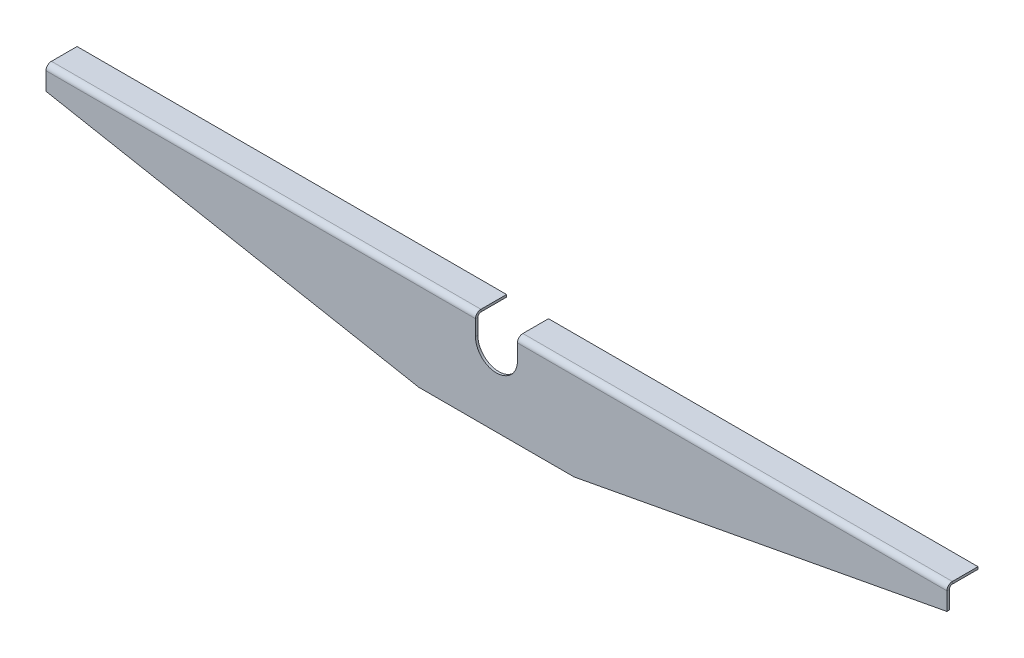
ISO-10303-21;
HEADER;
FILE_DESCRIPTION(('STEP AP214'),'2;1');
FILE_NAME('part.step','',(''),(''),'','','');
FILE_SCHEMA(('AUTOMOTIVE_DESIGN { 1 0 10303 214 1 1 1 1 }'));
ENDSEC;
DATA;
#1=APPLICATION_CONTEXT('core data for automotive mechanical design processes');
#2=APPLICATION_PROTOCOL_DEFINITION('international standard','automotive_design',2000,#1);
#3=PRODUCT_CONTEXT('',#1,'mechanical');
#4=PRODUCT('Part','Part','',(#3));
#5=PRODUCT_RELATED_PRODUCT_CATEGORY('part','',(#4));
#6=PRODUCT_DEFINITION_FORMATION('','',#4);
#7=PRODUCT_DEFINITION_CONTEXT('part definition',#1,'design');
#8=PRODUCT_DEFINITION('design','',#6,#7);
#9=PRODUCT_DEFINITION_SHAPE('','',#8);
#10=(LENGTH_UNIT() NAMED_UNIT(*) SI_UNIT(.MILLI.,.METRE.));
#11=(NAMED_UNIT(*) PLANE_ANGLE_UNIT() SI_UNIT($,.RADIAN.));
#12=(NAMED_UNIT(*) SI_UNIT($,.STERADIAN.) SOLID_ANGLE_UNIT());
#13=UNCERTAINTY_MEASURE_WITH_UNIT(LENGTH_MEASURE(1.E-05),#10,'distance_accuracy_value','');
#14=(GEOMETRIC_REPRESENTATION_CONTEXT(3) GLOBAL_UNCERTAINTY_ASSIGNED_CONTEXT((#13)) GLOBAL_UNIT_ASSIGNED_CONTEXT((#10,
#11,#12)) REPRESENTATION_CONTEXT('',''));
#15=CARTESIAN_POINT('',(0.,0.,0.));
#16=DIRECTION('',(0.,0.,1.));
#17=DIRECTION('',(1.,0.,0.));
#18=AXIS2_PLACEMENT_3D('',#15,#16,#17);
#19=CARTESIAN_POINT('',(-13.5000000000002,-3.50000000000006,-20.));
#20=DIRECTION('',(1.00000000000001,0.,0.));
#21=DIRECTION('',(0.,0.,-1.));
#22=AXIS2_PLACEMENT_3D('',#19,#20,#21);
#23=PLANE('',#22);
#24=DIRECTION('',(0.,0.,1.));
#25=VECTOR('',#24,1.);
#26=CARTESIAN_POINT('',(-13.5000000000002,10.0000000000001,0.));
#27=LINE('',#26,#25);
#28=CARTESIAN_POINT('',(-13.5000000000002,10.0000000000002,-20.));
#29=VERTEX_POINT('',#28);
#30=CARTESIAN_POINT('',(-13.5000000000002,10.0000000000001,-3.49999999999995));
#31=VERTEX_POINT('',#30);
#32=EDGE_CURVE('E240',#29,#31,#27,.T.);
#33=ORIENTED_EDGE('',*,*,#32,.T.);
#34=DIRECTION('',(0.,-1.00000000000001,0.));
#35=VECTOR('',#34,1.);
#36=CARTESIAN_POINT('',(-13.5000000000002,10.0000000000001,-3.49999999999995));
#37=LINE('',#36,#35);
#38=CARTESIAN_POINT('',(-13.5000000000002,8.5000000000001,-3.49999999999995));
#39=VERTEX_POINT('',#38);
#40=EDGE_CURVE('E13',#31,#39,#37,.T.);
#41=ORIENTED_EDGE('',*,*,#40,.T.);
#42=DIRECTION('',(0.,0.,1.));
#43=VECTOR('',#42,1.);
#44=CARTESIAN_POINT('',(-13.5000000000002,8.50000000000009,0.));
#45=LINE('',#44,#43);
#46=CARTESIAN_POINT('',(-13.5000000000002,8.50000000000016,-20.));
#47=VERTEX_POINT('',#46);
#48=EDGE_CURVE('E85',#47,#39,#45,.T.);
#49=ORIENTED_EDGE('',*,*,#48,.F.);
#50=DIRECTION('',(0.,1.00000000000001,0.));
#51=VECTOR('',#50,1.);
#52=CARTESIAN_POINT('',(-13.5000000000002,10.0000000000002,-20.));
#53=LINE('',#52,#51);
#54=EDGE_CURVE('E390',#47,#29,#53,.T.);
#55=ORIENTED_EDGE('',*,*,#54,.T.);
#56=EDGE_LOOP('',(#33,#41,#49,#55));
#57=FACE_BOUND('',#56,.T.);
#58=ADVANCED_FACE('F70',(#57),#23,.T.);
#59=DIRECTION('',(0.,-1.00000000000001,0.));
#60=VECTOR('',#59,1.);
#61=CARTESIAN_POINT('',(-13.5000000000002,0.,-1.49999999999995));
#62=LINE('',#61,#60);
#63=CARTESIAN_POINT('',(-13.5000000000002,6.50000000000011,-1.49999999999995));
#64=VERTEX_POINT('',#63);
#65=CARTESIAN_POINT('',(-13.5000000000002,-3.50000000000006,-1.49999999999995));
#66=VERTEX_POINT('',#65);
#67=EDGE_CURVE('E237',#64,#66,#62,.T.);
#68=ORIENTED_EDGE('',*,*,#67,.F.);
#69=DIRECTION('',(0.,0.,1.));
#70=VECTOR('',#69,1.);
#71=CARTESIAN_POINT('',(-13.5000000000002,6.50000000000011,-1.49999999999995));
#72=LINE('',#71,#70);
#73=CARTESIAN_POINT('',(-13.5000000000002,6.50000000000011,0.));
#74=VERTEX_POINT('',#73);
#75=EDGE_CURVE('E79',#64,#74,#72,.T.);
#76=ORIENTED_EDGE('',*,*,#75,.T.);
#77=DIRECTION('',(0.,1.00000000000001,0.));
#78=VECTOR('',#77,1.);
#79=CARTESIAN_POINT('',(-13.5000000000002,-3.50000000000006,0.));
#80=LINE('',#79,#78);
#81=CARTESIAN_POINT('',(-13.5000000000002,-3.50000000000006,0.));
#82=VERTEX_POINT('',#81);
#83=EDGE_CURVE('E213',#82,#74,#80,.T.);
#84=ORIENTED_EDGE('',*,*,#83,.F.);
#85=DIRECTION('',(0.,0.,1.));
#86=VECTOR('',#85,1.);
#87=CARTESIAN_POINT('',(-13.5000000000002,-3.50000000000006,-20.));
#88=LINE('',#87,#86);
#89=EDGE_CURVE('E197',#66,#82,#88,.T.);
#90=ORIENTED_EDGE('',*,*,#89,.F.);
#91=EDGE_LOOP('',(#68,#76,#84,#90));
#92=FACE_BOUND('',#91,.T.);
#93=ADVANCED_FACE('F214',(#92),#23,.T.);
#94=CARTESIAN_POINT('',(13.5000000000002,-3.50000000000007,-20.));
#95=DIRECTION('',(1.00000000000001,0.,0.));
#96=DIRECTION('',(0.,0.,-1.));
#97=AXIS2_PLACEMENT_3D('',#94,#95,#96);
#98=PLANE('',#97);
#99=DIRECTION('',(0.,0.,1.));
#100=VECTOR('',#99,1.);
#101=CARTESIAN_POINT('',(13.5000000000002,8.50000000000006,0.));
#102=LINE('',#101,#100);
#103=CARTESIAN_POINT('',(13.5000000000002,8.50000000000013,-20.));
#104=VERTEX_POINT('',#103);
#105=CARTESIAN_POINT('',(13.5000000000002,8.50000000000007,-3.49999999999995));
#106=VERTEX_POINT('',#105);
#107=EDGE_CURVE('E248',#104,#106,#102,.T.);
#108=ORIENTED_EDGE('',*,*,#107,.T.);
#109=DIRECTION('',(0.,1.00000000000001,0.));
#110=VECTOR('',#109,1.);
#111=CARTESIAN_POINT('',(13.5000000000002,8.50000000000007,-3.49999999999995));
#112=LINE('',#111,#110);
#113=CARTESIAN_POINT('',(13.5000000000002,10.0000000000001,-3.49999999999995));
#114=VERTEX_POINT('',#113);
#115=EDGE_CURVE('E409',#106,#114,#112,.T.);
#116=ORIENTED_EDGE('',*,*,#115,.T.);
#117=DIRECTION('',(0.,0.,1.));
#118=VECTOR('',#117,1.);
#119=CARTESIAN_POINT('',(13.5000000000002,10.0000000000001,0.));
#120=LINE('',#119,#118);
#121=CARTESIAN_POINT('',(13.5000000000002,10.0000000000001,-20.));
#122=VERTEX_POINT('',#121);
#123=EDGE_CURVE('E259',#122,#114,#120,.T.);
#124=ORIENTED_EDGE('',*,*,#123,.F.);
#125=DIRECTION('',(0.,1.00000000000001,0.));
#126=VECTOR('',#125,1.);
#127=CARTESIAN_POINT('',(13.5000000000002,10.0000000000001,-20.));
#128=LINE('',#127,#126);
#129=EDGE_CURVE('E402',#104,#122,#128,.T.);
#130=ORIENTED_EDGE('',*,*,#129,.F.);
#131=EDGE_LOOP('',(#108,#116,#124,#130));
#132=FACE_BOUND('',#131,.T.);
#133=ADVANCED_FACE('F559',(#132),#98,.F.);
#134=DIRECTION('',(0.,1.00000000000001,0.));
#135=VECTOR('',#134,1.);
#136=CARTESIAN_POINT('',(13.5000000000002,-3.50000000000007,0.));
#137=LINE('',#136,#135);
#138=CARTESIAN_POINT('',(13.5000000000002,-3.50000000000007,0.));
#139=VERTEX_POINT('',#138);
#140=CARTESIAN_POINT('',(13.5000000000002,6.50000000000002,0.));
#141=VERTEX_POINT('',#140);
#142=EDGE_CURVE('E219',#139,#141,#137,.T.);
#143=ORIENTED_EDGE('',*,*,#142,.T.);
#144=DIRECTION('',(0.,0.,-1.));
#145=VECTOR('',#144,1.);
#146=CARTESIAN_POINT('',(13.5000000000002,6.50000000000002,0.));
#147=LINE('',#146,#145);
#148=CARTESIAN_POINT('',(13.5000000000002,6.50000000000002,-1.49999999999995));
#149=VERTEX_POINT('',#148);
#150=EDGE_CURVE('E406',#141,#149,#147,.T.);
#151=ORIENTED_EDGE('',*,*,#150,.T.);
#152=DIRECTION('',(0.,-1.00000000000001,0.));
#153=VECTOR('',#152,1.);
#154=CARTESIAN_POINT('',(13.5000000000002,0.,-1.50000000000006));
#155=LINE('',#154,#153);
#156=CARTESIAN_POINT('',(13.5000000000002,-3.50000000000007,-1.50000000000006));
#157=VERTEX_POINT('',#156);
#158=EDGE_CURVE('E256',#149,#157,#155,.T.);
#159=ORIENTED_EDGE('',*,*,#158,.T.);
#160=DIRECTION('',(0.,0.,1.));
#161=VECTOR('',#160,1.);
#162=CARTESIAN_POINT('',(13.5000000000002,-3.50000000000007,-20.));
#163=LINE('',#162,#161);
#164=EDGE_CURVE('E210',#157,#139,#163,.T.);
#165=ORIENTED_EDGE('',*,*,#164,.T.);
#166=EDGE_LOOP('',(#143,#151,#159,#165));
#167=FACE_BOUND('',#166,.T.);
#168=ADVANCED_FACE('F555',(#167),#98,.F.);
#169=CARTESIAN_POINT('',(290.000000000003,6.50000000000007,-3.49999999999995));
#170=DIRECTION('',(1.00000000000001,0.,0.));
#171=DIRECTION('',(0.,1.00000000000001,0.));
#172=AXIS2_PLACEMENT_3D('',#169,#170,#171);
#173=CYLINDRICAL_SURFACE('',#172,3.5);
#174=DIRECTION('',(1.00000000000001,0.,0.));
#175=VECTOR('',#174,1.);
#176=CARTESIAN_POINT('',(290.000000000003,6.50000000000007,0.));
#177=LINE('',#176,#175);
#178=CARTESIAN_POINT('',(-290.000000000003,6.50000000000005,0.));
#179=VERTEX_POINT('',#178);
#180=EDGE_CURVE('E324',#74,#179,#177,.F.);
#181=ORIENTED_EDGE('',*,*,#180,.F.);
#182=CARTESIAN_POINT('',(-13.5000000000002,6.50000000000011,-3.49999999999995));
#183=DIRECTION('',(1.00000000000001,0.,0.));
#184=DIRECTION('',(0.,0.,-1.));
#185=AXIS2_PLACEMENT_3D('',#182,#183,#184);
#186=CIRCLE('',#185,3.5);
#187=EDGE_CURVE('E244',#74,#31,#186,.F.);
#188=ORIENTED_EDGE('',*,*,#187,.T.);
#189=DIRECTION('',(1.00000000000001,0.,0.));
#190=VECTOR('',#189,1.);
#191=CARTESIAN_POINT('',(-290.000000000004,10.0000000000001,-3.49999999999995));
#192=LINE('',#191,#190);
#193=CARTESIAN_POINT('',(-290.000000000004,10.0000000000001,-3.49999999999995));
#194=VERTEX_POINT('',#193);
#195=EDGE_CURVE('E307',#31,#194,#192,.F.);
#196=ORIENTED_EDGE('',*,*,#195,.T.);
#197=CARTESIAN_POINT('',(-290.000000000003,6.50000000000005,-3.49999999999995));
#198=DIRECTION('',(1.00000000000001,0.,0.));
#199=DIRECTION('',(0.,0.,-1.));
#200=AXIS2_PLACEMENT_3D('',#197,#198,#199);
#201=CIRCLE('',#200,3.5);
#202=EDGE_CURVE('E323',#179,#194,#201,.F.);
#203=ORIENTED_EDGE('',*,*,#202,.F.);
#204=EDGE_LOOP('',(#181,#188,#196,#203));
#205=FACE_BOUND('',#204,.T.);
#206=ADVANCED_FACE('F551',(#205),#173,.T.);
#207=CARTESIAN_POINT('',(290.000000000003,6.50000000000007,-3.49999999999995));
#208=DIRECTION('',(1.00000000000001,0.,0.));
#209=DIRECTION('',(0.,1.00000000000001,0.));
#210=AXIS2_PLACEMENT_3D('',#207,#208,#209);
#211=CYLINDRICAL_SURFACE('',#210,2.);
#212=CARTESIAN_POINT('',(-13.5000000000002,6.50000000000011,-3.49999999999995));
#213=DIRECTION('',(1.00000000000001,0.,0.));
#214=DIRECTION('',(0.,0.,-1.));
#215=AXIS2_PLACEMENT_3D('',#212,#213,#214);
#216=CIRCLE('',#215,2.);
#217=EDGE_CURVE('E233',#64,#39,#216,.F.);
#218=ORIENTED_EDGE('',*,*,#217,.F.);
#219=DIRECTION('',(1.00000000000001,0.,0.));
#220=VECTOR('',#219,1.);
#221=CARTESIAN_POINT('',(290.000000000003,6.50000000000007,-1.49999999999995));
#222=LINE('',#221,#220);
#223=CARTESIAN_POINT('',(-290.000000000003,6.50000000000005,-1.49999999999995));
#224=VERTEX_POINT('',#223);
#225=EDGE_CURVE('E339',#64,#224,#222,.F.);
#226=ORIENTED_EDGE('',*,*,#225,.T.);
#227=CARTESIAN_POINT('',(-290.000000000003,6.50000000000005,-3.49999999999995));
#228=DIRECTION('',(1.00000000000001,0.,0.));
#229=DIRECTION('',(0.,0.,-1.));
#230=AXIS2_PLACEMENT_3D('',#227,#228,#229);
#231=CIRCLE('',#230,2.);
#232=CARTESIAN_POINT('',(-290.000000000004,8.5000000000001,-3.49999999999995));
#233=VERTEX_POINT('',#232);
#234=EDGE_CURVE('E333',#224,#233,#231,.F.);
#235=ORIENTED_EDGE('',*,*,#234,.T.);
#236=DIRECTION('',(1.00000000000001,0.,0.));
#237=VECTOR('',#236,1.);
#238=CARTESIAN_POINT('',(-290.000000000004,8.5000000000001,-3.49999999999995));
#239=LINE('',#238,#237);
#240=EDGE_CURVE('E312',#233,#39,#239,.T.);
#241=ORIENTED_EDGE('',*,*,#240,.T.);
#242=EDGE_LOOP('',(#218,#226,#235,#241));
#243=FACE_BOUND('',#242,.T.);
#244=ADVANCED_FACE('F534',(#243),#211,.F.);
#245=CARTESIAN_POINT('',(0.,10.0000000000001,0.));
#246=DIRECTION('',(0.,-1.00000000000001,0.));
#247=DIRECTION('',(0.,0.,-1.));
#248=AXIS2_PLACEMENT_3D('',#245,#246,#247);
#249=PLANE('',#248);
#250=ORIENTED_EDGE('',*,*,#32,.F.);
#251=DIRECTION('',(-1.00000000000001,0.,0.));
#252=VECTOR('',#251,1.);
#253=CARTESIAN_POINT('',(0.,10.0000000000002,-20.));
#254=LINE('',#253,#252);
#255=CARTESIAN_POINT('',(-290.000000000004,10.0000000000002,-19.9999999999999));
#256=VERTEX_POINT('',#255);
#257=EDGE_CURVE('E287',#29,#256,#254,.T.);
#258=ORIENTED_EDGE('',*,*,#257,.T.);
#259=DIRECTION('',(0.,0.,1.));
#260=VECTOR('',#259,1.);
#261=CARTESIAN_POINT('',(-290.000000000004,10.0000000000001,0.));
#262=LINE('',#261,#260);
#263=EDGE_CURVE('E279',#256,#194,#262,.T.);
#264=ORIENTED_EDGE('',*,*,#263,.T.);
#265=ORIENTED_EDGE('',*,*,#195,.F.);
#266=EDGE_LOOP('',(#250,#258,#264,#265));
#267=FACE_BOUND('',#266,.T.);
#268=ADVANCED_FACE('F549',(#267),#249,.F.);
#269=CARTESIAN_POINT('',(0.,8.50000000000009,0.));
#270=DIRECTION('',(0.,-1.00000000000001,0.));
#271=DIRECTION('',(0.,0.,-1.));
#272=AXIS2_PLACEMENT_3D('',#269,#270,#271);
#273=PLANE('',#272);
#274=DIRECTION('',(1.00000000000001,0.,0.));
#275=VECTOR('',#274,1.);
#276=CARTESIAN_POINT('',(-290.000000000004,8.50000000000016,-20.));
#277=LINE('',#276,#275);
#278=CARTESIAN_POINT('',(-290.000000000004,8.50000000000016,-20.));
#279=VERTEX_POINT('',#278);
#280=EDGE_CURVE('E299',#47,#279,#277,.F.);
#281=ORIENTED_EDGE('',*,*,#280,.F.);
#282=ORIENTED_EDGE('',*,*,#48,.T.);
#283=ORIENTED_EDGE('',*,*,#240,.F.);
#284=DIRECTION('',(0.,0.,-1.));
#285=VECTOR('',#284,1.);
#286=CARTESIAN_POINT('',(-290.000000000004,8.50000000000009,-1.49999999999995));
#287=LINE('',#286,#285);
#288=EDGE_CURVE('E291',#279,#233,#287,.F.);
#289=ORIENTED_EDGE('',*,*,#288,.F.);
#290=EDGE_LOOP('',(#281,#282,#283,#289));
#291=FACE_BOUND('',#290,.T.);
#292=ADVANCED_FACE('F538',(#291),#273,.T.);
#293=CARTESIAN_POINT('',(-290.000000000004,10.0000000000002,-19.9999999999999));
#294=DIRECTION('',(0.,0.,1.));
#295=DIRECTION('',(0.,-1.00000000000001,0.));
#296=AXIS2_PLACEMENT_3D('',#293,#294,#295);
#297=PLANE('',#296);
#298=ORIENTED_EDGE('',*,*,#54,.F.);
#299=ORIENTED_EDGE('',*,*,#280,.T.);
#300=DIRECTION('',(0.,-1.00000000000001,0.));
#301=VECTOR('',#300,1.);
#302=CARTESIAN_POINT('',(-290.000000000004,10.0000000000002,-19.9999999999999));
#303=LINE('',#302,#301);
#304=EDGE_CURVE('E275',#256,#279,#303,.T.);
#305=ORIENTED_EDGE('',*,*,#304,.F.);
#306=ORIENTED_EDGE('',*,*,#257,.F.);
#307=EDGE_LOOP('',(#298,#299,#305,#306));
#308=FACE_BOUND('',#307,.T.);
#309=ADVANCED_FACE('F545',(#308),#297,.F.);
#310=CARTESIAN_POINT('',(290.000000000002,10.0000000000001,-1.50000000000006));
#311=DIRECTION('',(1.00000000000001,0.,0.));
#312=DIRECTION('',(0.,1.00000000000001,0.));
#313=AXIS2_PLACEMENT_3D('',#310,#311,#312);
#314=PLANE('',#313);
#315=DIRECTION('',(0.,1.00000000000001,0.));
#316=VECTOR('',#315,1.);
#317=CARTESIAN_POINT('',(290.000000000002,10.0000000000001,-1.50000000000006));
#318=LINE('',#317,#316);
#319=CARTESIAN_POINT('',(290.000000000002,-5.00000000000008,-1.50000000000006));
#320=VERTEX_POINT('',#319);
#321=CARTESIAN_POINT('',(290.000000000003,6.50000000000007,-1.50000000000006));
#322=VERTEX_POINT('',#321);
#323=EDGE_CURVE('E366',#320,#322,#318,.T.);
#324=ORIENTED_EDGE('',*,*,#323,.T.);
#325=DIRECTION('',(0.,0.,1.));
#326=VECTOR('',#325,1.);
#327=CARTESIAN_POINT('',(290.000000000003,6.50000000000007,-1.49999999999995));
#328=LINE('',#327,#326);
#329=CARTESIAN_POINT('',(290.000000000003,6.50000000000007,0.));
#330=VERTEX_POINT('',#329);
#331=EDGE_CURVE('E328',#322,#330,#328,.T.);
#332=ORIENTED_EDGE('',*,*,#331,.T.);
#333=DIRECTION('',(0.,1.00000000000001,0.));
#334=VECTOR('',#333,1.);
#335=CARTESIAN_POINT('',(290.000000000002,10.0000000000001,0.));
#336=LINE('',#335,#334);
#337=CARTESIAN_POINT('',(290.000000000002,-5.00000000000008,0.));
#338=VERTEX_POINT('',#337);
#339=EDGE_CURVE('E354',#338,#330,#336,.T.);
#340=ORIENTED_EDGE('',*,*,#339,.F.);
#341=DIRECTION('',(0.,0.,1.));
#342=VECTOR('',#341,1.);
#343=CARTESIAN_POINT('',(290.000000000002,-5.00000000000008,-1.50000000000006));
#344=LINE('',#343,#342);
#345=EDGE_CURVE('E387',#320,#338,#344,.T.);
#346=ORIENTED_EDGE('',*,*,#345,.F.);
#347=EDGE_LOOP('',(#324,#332,#340,#346));
#348=FACE_BOUND('',#347,.T.);
#349=ADVANCED_FACE('F508',(#348),#314,.T.);
#350=CARTESIAN_POINT('',(0.,0.,-1.49999999999995));
#351=DIRECTION('',(0.,0.,-1.));
#352=DIRECTION('',(-1.00000000000001,0.,0.));
#353=AXIS2_PLACEMENT_3D('',#350,#351,#352);
#354=PLANE('',#353);
#355=ORIENTED_EDGE('',*,*,#158,.F.);
#356=EDGE_CURVE('E93',#322,#149,#222,.F.);
#357=ORIENTED_EDGE('',*,*,#356,.F.);
#358=ORIENTED_EDGE('',*,*,#323,.F.);
#359=DIRECTION('',(0.982872186934334,0.184288535050187,0.));
#360=VECTOR('',#359,1.);
#361=CARTESIAN_POINT('',(290.000000000002,-5.00000000000008,-1.50000000000006));
#362=LINE('',#361,#360);
#363=CARTESIAN_POINT('',(50.0000000000006,-50.0000000000006,-1.50000000000006));
#364=VERTEX_POINT('',#363);
#365=EDGE_CURVE('E362',#364,#320,#362,.T.);
#366=ORIENTED_EDGE('',*,*,#365,.F.);
#367=DIRECTION('',(1.00000000000001,0.,0.));
#368=VECTOR('',#367,1.);
#369=CARTESIAN_POINT('',(50.0000000000006,-50.0000000000006,-1.50000000000006));
#370=LINE('',#369,#368);
#371=CARTESIAN_POINT('',(-50.0000000000009,-50.0000000000006,-1.49999999999995));
#372=VERTEX_POINT('',#371);
#373=EDGE_CURVE('E358',#372,#364,#370,.T.);
#374=ORIENTED_EDGE('',*,*,#373,.F.);
#375=DIRECTION('',(0.982872186934334,-0.184288535050187,0.));
#376=VECTOR('',#375,1.);
#377=CARTESIAN_POINT('',(-50.0000000000009,-50.0000000000006,-1.49999999999995));
#378=LINE('',#377,#376);
#379=CARTESIAN_POINT('',(-290.000000000004,-5.00000000000006,-1.49999999999995));
#380=VERTEX_POINT('',#379);
#381=EDGE_CURVE('E353',#380,#372,#378,.T.);
#382=ORIENTED_EDGE('',*,*,#381,.F.);
#383=DIRECTION('',(0.,-1.00000000000001,0.));
#384=VECTOR('',#383,1.);
#385=CARTESIAN_POINT('',(-290.000000000004,-5.00000000000006,-1.49999999999995));
#386=LINE('',#385,#384);
#387=EDGE_CURVE('E350',#224,#380,#386,.T.);
#388=ORIENTED_EDGE('',*,*,#387,.F.);
#389=ORIENTED_EDGE('',*,*,#225,.F.);
#390=ORIENTED_EDGE('',*,*,#67,.T.);
#391=CARTESIAN_POINT('',(0.,-3.50000000000006,-1.49999999999995));
#392=DIRECTION('',(0.,0.,-1.));
#393=DIRECTION('',(-1.00000000000001,0.,0.));
#394=AXIS2_PLACEMENT_3D('',#391,#392,#393);
#395=CIRCLE('',#394,13.5);
#396=EDGE_CURVE('E205',#157,#66,#395,.T.);
#397=ORIENTED_EDGE('',*,*,#396,.F.);
#398=EDGE_LOOP('',(#355,#357,#358,#366,#374,#382,#388,#389,#390,#397));
#399=FACE_BOUND('',#398,.T.);
#400=ADVANCED_FACE('F510',(#399),#354,.T.);
#401=CARTESIAN_POINT('',(0.,0.,0.));
#402=DIRECTION('',(0.,0.,-1.));
#403=DIRECTION('',(-1.00000000000001,0.,0.));
#404=AXIS2_PLACEMENT_3D('',#401,#402,#403);
#405=PLANE('',#404);
#406=EDGE_CURVE('E320',#330,#141,#177,.F.);
#407=ORIENTED_EDGE('',*,*,#406,.T.);
#408=ORIENTED_EDGE('',*,*,#142,.F.);
#409=CARTESIAN_POINT('',(0.,-3.50000000000006,0.));
#410=DIRECTION('',(0.,0.,1.));
#411=DIRECTION('',(1.00000000000001,0.,0.));
#412=AXIS2_PLACEMENT_3D('',#409,#410,#411);
#413=CIRCLE('',#412,13.5);
#414=EDGE_CURVE('E202',#82,#139,#413,.T.);
#415=ORIENTED_EDGE('',*,*,#414,.F.);
#416=ORIENTED_EDGE('',*,*,#83,.T.);
#417=ORIENTED_EDGE('',*,*,#180,.T.);
#418=DIRECTION('',(0.,-1.00000000000001,0.));
#419=VECTOR('',#418,1.);
#420=CARTESIAN_POINT('',(-290.000000000004,-5.00000000000006,0.));
#421=LINE('',#420,#419);
#422=CARTESIAN_POINT('',(-290.000000000004,-5.00000000000006,0.));
#423=VERTEX_POINT('',#422);
#424=EDGE_CURVE('E347',#179,#423,#421,.T.);
#425=ORIENTED_EDGE('',*,*,#424,.T.);
#426=DIRECTION('',(0.982872186934334,-0.184288535050187,0.));
#427=VECTOR('',#426,1.);
#428=CARTESIAN_POINT('',(-50.0000000000009,-50.0000000000006,0.));
#429=LINE('',#428,#427);
#430=CARTESIAN_POINT('',(-50.0000000000009,-50.0000000000006,0.));
#431=VERTEX_POINT('',#430);
#432=EDGE_CURVE('E372',#423,#431,#429,.T.);
#433=ORIENTED_EDGE('',*,*,#432,.T.);
#434=DIRECTION('',(1.00000000000001,0.,0.));
#435=VECTOR('',#434,1.);
#436=CARTESIAN_POINT('',(50.0000000000007,-50.0000000000006,0.));
#437=LINE('',#436,#435);
#438=CARTESIAN_POINT('',(50.0000000000007,-50.0000000000006,0.));
#439=VERTEX_POINT('',#438);
#440=EDGE_CURVE('E376',#431,#439,#437,.T.);
#441=ORIENTED_EDGE('',*,*,#440,.T.);
#442=DIRECTION('',(0.982872186934334,0.184288535050187,0.));
#443=VECTOR('',#442,1.);
#444=CARTESIAN_POINT('',(290.000000000002,-5.00000000000008,0.));
#445=LINE('',#444,#443);
#446=EDGE_CURVE('E380',#439,#338,#445,.T.);
#447=ORIENTED_EDGE('',*,*,#446,.T.);
#448=ORIENTED_EDGE('',*,*,#339,.T.);
#449=EDGE_LOOP('',(#407,#408,#415,#416,#417,#425,#433,#441,#447,#448));
#450=FACE_BOUND('',#449,.T.);
#451=ADVANCED_FACE('F222',(#450),#405,.F.);
#452=CARTESIAN_POINT('',(-290.000000000004,-5.00000000000006,-1.49999999999995));
#453=DIRECTION('',(-1.00000000000001,0.,0.));
#454=DIRECTION('',(0.,0.,1.));
#455=AXIS2_PLACEMENT_3D('',#452,#453,#454);
#456=PLANE('',#455);
#457=DIRECTION('',(0.,0.,1.));
#458=VECTOR('',#457,1.);
#459=CARTESIAN_POINT('',(-290.000000000003,6.50000000000005,-1.49999999999995));
#460=LINE('',#459,#458);
#461=EDGE_CURVE('E343',#224,#179,#460,.T.);
#462=ORIENTED_EDGE('',*,*,#461,.F.);
#463=ORIENTED_EDGE('',*,*,#387,.T.);
#464=DIRECTION('',(0.,0.,1.));
#465=VECTOR('',#464,1.);
#466=CARTESIAN_POINT('',(-290.000000000004,-5.00000000000006,-1.49999999999995));
#467=LINE('',#466,#465);
#468=EDGE_CURVE('E369',#380,#423,#467,.T.);
#469=ORIENTED_EDGE('',*,*,#468,.T.);
#470=ORIENTED_EDGE('',*,*,#424,.F.);
#471=EDGE_LOOP('',(#462,#463,#469,#470));
#472=FACE_BOUND('',#471,.T.);
#473=ADVANCED_FACE('F72',(#472),#456,.T.);
#474=CARTESIAN_POINT('',(290.000000000002,-5.00000000000008,-1.50000000000006));
#475=DIRECTION('',(0.184288535050187,-0.982872186934334,0.));
#476=DIRECTION('',(0.982872186934334,0.184288535050187,0.));
#477=AXIS2_PLACEMENT_3D('',#474,#475,#476);
#478=PLANE('',#477);
#479=ORIENTED_EDGE('',*,*,#446,.F.);
#480=DIRECTION('',(0.,0.,1.));
#481=VECTOR('',#480,1.);
#482=CARTESIAN_POINT('',(50.0000000000006,-50.0000000000006,-1.50000000000006));
#483=LINE('',#482,#481);
#484=EDGE_CURVE('E391',#364,#439,#483,.T.);
#485=ORIENTED_EDGE('',*,*,#484,.F.);
#486=ORIENTED_EDGE('',*,*,#365,.T.);
#487=ORIENTED_EDGE('',*,*,#345,.T.);
#488=EDGE_LOOP('',(#479,#485,#486,#487));
#489=FACE_BOUND('',#488,.T.);
#490=ADVANCED_FACE('F513',(#489),#478,.T.);
#491=CARTESIAN_POINT('',(50.0000000000006,-50.0000000000006,-1.50000000000006));
#492=DIRECTION('',(0.,-1.00000000000001,0.));
#493=DIRECTION('',(0.,0.,-1.));
#494=AXIS2_PLACEMENT_3D('',#491,#492,#493);
#495=PLANE('',#494);
#496=ORIENTED_EDGE('',*,*,#440,.F.);
#497=DIRECTION('',(0.,0.,1.));
#498=VECTOR('',#497,1.);
#499=CARTESIAN_POINT('',(-50.0000000000009,-50.0000000000006,-1.49999999999995));
#500=LINE('',#499,#498);
#501=EDGE_CURVE('E394',#372,#431,#500,.T.);
#502=ORIENTED_EDGE('',*,*,#501,.F.);
#503=ORIENTED_EDGE('',*,*,#373,.T.);
#504=ORIENTED_EDGE('',*,*,#484,.T.);
#505=EDGE_LOOP('',(#496,#502,#503,#504));
#506=FACE_BOUND('',#505,.T.);
#507=ADVANCED_FACE('F516',(#506),#495,.T.);
#508=CARTESIAN_POINT('',(-50.0000000000009,-50.0000000000006,-1.49999999999995));
#509=DIRECTION('',(-0.184288535050187,-0.982872186934334,0.));
#510=DIRECTION('',(0.982872186934334,-0.184288535050187,0.));
#511=AXIS2_PLACEMENT_3D('',#508,#509,#510);
#512=PLANE('',#511);
#513=ORIENTED_EDGE('',*,*,#432,.F.);
#514=ORIENTED_EDGE('',*,*,#468,.F.);
#515=ORIENTED_EDGE('',*,*,#381,.T.);
#516=ORIENTED_EDGE('',*,*,#501,.T.);
#517=EDGE_LOOP('',(#513,#514,#515,#516));
#518=FACE_BOUND('',#517,.T.);
#519=ADVANCED_FACE('F522',(#518),#512,.T.);
#520=CARTESIAN_POINT('',(-290.000000000003,6.50000000000005,-3.49999999999995));
#521=DIRECTION('',(-1.00000000000001,0.,0.));
#522=DIRECTION('',(0.,0.,1.));
#523=AXIS2_PLACEMENT_3D('',#520,#521,#522);
#524=PLANE('',#523);
#525=DIRECTION('',(0.,-1.00000000000001,0.));
#526=VECTOR('',#525,1.);
#527=CARTESIAN_POINT('',(-290.000000000004,10.0000000000001,-3.49999999999995));
#528=LINE('',#527,#526);
#529=EDGE_CURVE('E269',#233,#194,#528,.F.);
#530=ORIENTED_EDGE('',*,*,#529,.F.);
#531=ORIENTED_EDGE('',*,*,#234,.F.);
#532=ORIENTED_EDGE('',*,*,#461,.T.);
#533=ORIENTED_EDGE('',*,*,#202,.T.);
#534=EDGE_LOOP('',(#530,#531,#532,#533));
#535=FACE_BOUND('',#534,.T.);
#536=ADVANCED_FACE('F529',(#535),#524,.T.);
#537=CARTESIAN_POINT('',(290.000000000003,6.50000000000007,-3.49999999999995));
#538=DIRECTION('',(-1.00000000000001,0.,0.));
#539=DIRECTION('',(0.,0.,1.));
#540=AXIS2_PLACEMENT_3D('',#537,#538,#539);
#541=PLANE('',#540);
#542=CARTESIAN_POINT('',(290.000000000003,6.50000000000007,-3.49999999999995));
#543=DIRECTION('',(1.00000000000001,0.,0.));
#544=DIRECTION('',(0.,0.,-1.));
#545=AXIS2_PLACEMENT_3D('',#542,#543,#544);
#546=CIRCLE('',#545,2.);
#547=CARTESIAN_POINT('',(290.000000000002,8.5000000000001,-3.49999999999995));
#548=VERTEX_POINT('',#547);
#549=EDGE_CURVE('E274',#548,#322,#546,.T.);
#550=ORIENTED_EDGE('',*,*,#549,.F.);
#551=DIRECTION('',(0.,-1.00000000000001,0.));
#552=VECTOR('',#551,1.);
#553=CARTESIAN_POINT('',(290.000000000002,8.5000000000001,-3.49999999999995));
#554=LINE('',#553,#552);
#555=CARTESIAN_POINT('',(290.000000000002,10.0000000000001,-3.49999999999995));
#556=VERTEX_POINT('',#555);
#557=EDGE_CURVE('E308',#548,#556,#554,.F.);
#558=ORIENTED_EDGE('',*,*,#557,.T.);
#559=CARTESIAN_POINT('',(290.000000000003,6.50000000000007,-3.49999999999995));
#560=DIRECTION('',(1.00000000000001,0.,0.));
#561=DIRECTION('',(0.,0.,-1.));
#562=AXIS2_PLACEMENT_3D('',#559,#560,#561);
#563=CIRCLE('',#562,3.5);
#564=EDGE_CURVE('E329',#556,#330,#563,.T.);
#565=ORIENTED_EDGE('',*,*,#564,.T.);
#566=ORIENTED_EDGE('',*,*,#331,.F.);
#567=EDGE_LOOP('',(#550,#558,#565,#566));
#568=FACE_BOUND('',#567,.T.);
#569=ADVANCED_FACE('F488',(#568),#541,.F.);
#570=CARTESIAN_POINT('',(13.5000000000002,6.50000000000002,-3.49999999999995));
#571=DIRECTION('',(1.00000000000001,0.,0.));
#572=DIRECTION('',(0.,0.,-1.));
#573=AXIS2_PLACEMENT_3D('',#570,#571,#572);
#574=CIRCLE('',#573,3.5);
#575=EDGE_CURVE('E263',#141,#114,#574,.F.);
#576=ORIENTED_EDGE('',*,*,#575,.F.);
#577=ORIENTED_EDGE('',*,*,#406,.F.);
#578=ORIENTED_EDGE('',*,*,#564,.F.);
#579=EDGE_CURVE('E303',#556,#114,#192,.F.);
#580=ORIENTED_EDGE('',*,*,#579,.T.);
#581=EDGE_LOOP('',(#576,#577,#578,#580));
#582=FACE_BOUND('',#581,.T.);
#583=ADVANCED_FACE('F503',(#582),#173,.T.);
#584=ORIENTED_EDGE('',*,*,#356,.T.);
#585=CARTESIAN_POINT('',(13.5000000000002,6.50000000000002,-3.49999999999995));
#586=DIRECTION('',(1.00000000000001,0.,0.));
#587=DIRECTION('',(0.,0.,-1.));
#588=AXIS2_PLACEMENT_3D('',#585,#586,#587);
#589=CIRCLE('',#588,2.);
#590=EDGE_CURVE('E252',#149,#106,#589,.F.);
#591=ORIENTED_EDGE('',*,*,#590,.T.);
#592=EDGE_CURVE('E316',#106,#548,#239,.T.);
#593=ORIENTED_EDGE('',*,*,#592,.T.);
#594=ORIENTED_EDGE('',*,*,#549,.T.);
#595=EDGE_LOOP('',(#584,#591,#593,#594));
#596=FACE_BOUND('',#595,.T.);
#597=ADVANCED_FACE('F480',(#596),#211,.F.);
#598=CARTESIAN_POINT('',(290.000000000002,10.0000000000002,-20.));
#599=DIRECTION('',(-1.00000000000001,0.,0.));
#600=DIRECTION('',(0.,0.,1.));
#601=AXIS2_PLACEMENT_3D('',#598,#599,#600);
#602=PLANE('',#601);
#603=ORIENTED_EDGE('',*,*,#557,.F.);
#604=DIRECTION('',(0.,0.,1.));
#605=VECTOR('',#604,1.);
#606=CARTESIAN_POINT('',(290.000000000002,8.50000000000016,-20.));
#607=LINE('',#606,#605);
#608=CARTESIAN_POINT('',(290.000000000002,8.50000000000016,-20.));
#609=VERTEX_POINT('',#608);
#610=EDGE_CURVE('E300',#548,#609,#607,.F.);
#611=ORIENTED_EDGE('',*,*,#610,.T.);
#612=DIRECTION('',(0.,-1.00000000000001,0.));
#613=VECTOR('',#612,1.);
#614=CARTESIAN_POINT('',(290.000000000002,10.0000000000002,-20.));
#615=LINE('',#614,#613);
#616=CARTESIAN_POINT('',(290.000000000002,10.0000000000002,-20.));
#617=VERTEX_POINT('',#616);
#618=EDGE_CURVE('E270',#617,#609,#615,.T.);
#619=ORIENTED_EDGE('',*,*,#618,.F.);
#620=DIRECTION('',(0.,0.,-1.));
#621=VECTOR('',#620,1.);
#622=CARTESIAN_POINT('',(290.000000000002,10.0000000000001,-8.88178419700125E-13));
#623=LINE('',#622,#621);
#624=EDGE_CURVE('E288',#556,#617,#623,.T.);
#625=ORIENTED_EDGE('',*,*,#624,.F.);
#626=EDGE_LOOP('',(#603,#611,#619,#625));
#627=FACE_BOUND('',#626,.T.);
#628=ADVANCED_FACE('F492',(#627),#602,.F.);
#629=CARTESIAN_POINT('',(-290.000000000004,10.0000000000001,-1.49999999999995));
#630=DIRECTION('',(1.00000000000001,0.,0.));
#631=DIRECTION('',(0.,0.,-1.));
#632=AXIS2_PLACEMENT_3D('',#629,#630,#631);
#633=PLANE('',#632);
#634=ORIENTED_EDGE('',*,*,#529,.T.);
#635=ORIENTED_EDGE('',*,*,#263,.F.);
#636=ORIENTED_EDGE('',*,*,#304,.T.);
#637=ORIENTED_EDGE('',*,*,#288,.T.);
#638=EDGE_LOOP('',(#634,#635,#636,#637));
#639=FACE_BOUND('',#638,.T.);
#640=ADVANCED_FACE('F540',(#639),#633,.F.);
#641=EDGE_CURVE('E283',#617,#122,#254,.T.);
#642=ORIENTED_EDGE('',*,*,#641,.T.);
#643=ORIENTED_EDGE('',*,*,#123,.T.);
#644=ORIENTED_EDGE('',*,*,#579,.F.);
#645=ORIENTED_EDGE('',*,*,#624,.T.);
#646=EDGE_LOOP('',(#642,#643,#644,#645));
#647=FACE_BOUND('',#646,.T.);
#648=ADVANCED_FACE('F500',(#647),#249,.F.);
#649=ORIENTED_EDGE('',*,*,#107,.F.);
#650=EDGE_CURVE('E295',#609,#104,#277,.F.);
#651=ORIENTED_EDGE('',*,*,#650,.F.);
#652=ORIENTED_EDGE('',*,*,#610,.F.);
#653=ORIENTED_EDGE('',*,*,#592,.F.);
#654=EDGE_LOOP('',(#649,#651,#652,#653));
#655=FACE_BOUND('',#654,.T.);
#656=ADVANCED_FACE('F495',(#655),#273,.T.);
#657=ORIENTED_EDGE('',*,*,#650,.T.);
#658=ORIENTED_EDGE('',*,*,#129,.T.);
#659=ORIENTED_EDGE('',*,*,#641,.F.);
#660=ORIENTED_EDGE('',*,*,#618,.T.);
#661=EDGE_LOOP('',(#657,#658,#659,#660));
#662=FACE_BOUND('',#661,.T.);
#663=ADVANCED_FACE('F498',(#662),#297,.F.);
#664=ORIENTED_EDGE('',*,*,#115,.F.);
#665=ORIENTED_EDGE('',*,*,#590,.F.);
#666=ORIENTED_EDGE('',*,*,#150,.F.);
#667=ORIENTED_EDGE('',*,*,#575,.T.);
#668=EDGE_LOOP('',(#664,#665,#666,#667));
#669=FACE_BOUND('',#668,.T.);
#670=ADVANCED_FACE('F557',(#669),#98,.F.);
#671=CARTESIAN_POINT('',(0.,-3.50000000000006,-20.));
#672=DIRECTION('',(0.,0.,1.));
#673=DIRECTION('',(1.00000000000001,0.,0.));
#674=AXIS2_PLACEMENT_3D('',#671,#672,#673);
#675=CYLINDRICAL_SURFACE('',#674,13.5);
#676=ORIENTED_EDGE('',*,*,#396,.T.);
#677=ORIENTED_EDGE('',*,*,#89,.T.);
#678=ORIENTED_EDGE('',*,*,#414,.T.);
#679=ORIENTED_EDGE('',*,*,#164,.F.);
#680=EDGE_LOOP('',(#676,#677,#678,#679));
#681=FACE_BOUND('',#680,.T.);
#682=ADVANCED_FACE('F199',(#681),#675,.F.);
#683=ORIENTED_EDGE('',*,*,#40,.F.);
#684=ORIENTED_EDGE('',*,*,#187,.F.);
#685=ORIENTED_EDGE('',*,*,#75,.F.);
#686=ORIENTED_EDGE('',*,*,#217,.T.);
#687=EDGE_LOOP('',(#683,#684,#685,#686));
#688=FACE_BOUND('',#687,.T.);
#689=ADVANCED_FACE('F553',(#688),#23,.T.);
#690=CLOSED_SHELL('',(#58,#93,#133,#168,#206,#244,#268,#292,#309,#349,#400,#451,#473,#490,#507,
#519,#536,#569,#583,#597,#628,#640,#648,#656,#663,#670,#682,#689));
#691=MANIFOLD_SOLID_BREP('B2',#690);
#692=ADVANCED_BREP_SHAPE_REPRESENTATION('',(#18,#691),#14);
#693=SHAPE_DEFINITION_REPRESENTATION(#9,#692);
ENDSEC;
END-ISO-10303-21;
